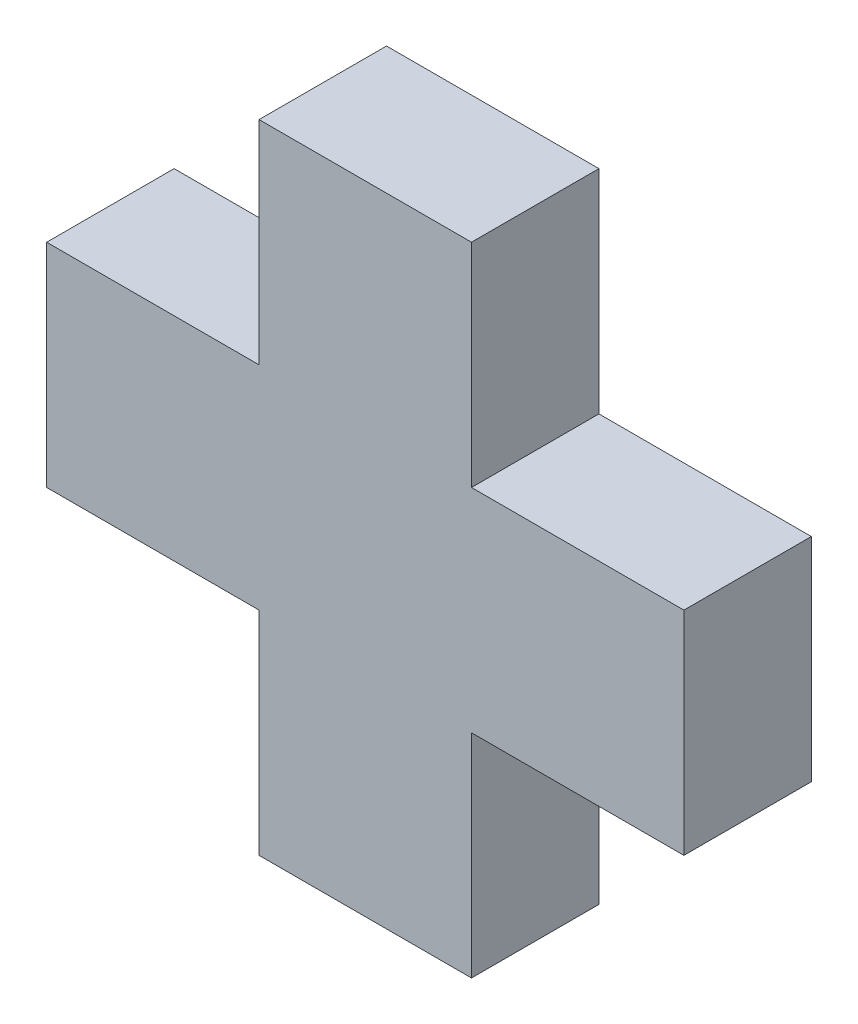
ISO-10303-21;
HEADER;
FILE_DESCRIPTION(('STEP AP214'),'2;1');
FILE_NAME('part.step','',(''),(''),'','','');
FILE_SCHEMA(('AUTOMOTIVE_DESIGN { 1 0 10303 214 1 1 1 1 }'));
ENDSEC;
DATA;
#1=APPLICATION_CONTEXT('core data for automotive mechanical design processes');
#2=APPLICATION_PROTOCOL_DEFINITION('international standard','automotive_design',2000,#1);
#3=PRODUCT_CONTEXT('',#1,'mechanical');
#4=PRODUCT('Part','Part','',(#3));
#5=PRODUCT_RELATED_PRODUCT_CATEGORY('part','',(#4));
#6=PRODUCT_DEFINITION_FORMATION('','',#4);
#7=PRODUCT_DEFINITION_CONTEXT('part definition',#1,'design');
#8=PRODUCT_DEFINITION('design','',#6,#7);
#9=PRODUCT_DEFINITION_SHAPE('','',#8);
#10=(LENGTH_UNIT() NAMED_UNIT(*) SI_UNIT(.MILLI.,.METRE.));
#11=(NAMED_UNIT(*) PLANE_ANGLE_UNIT() SI_UNIT($,.RADIAN.));
#12=(NAMED_UNIT(*) SI_UNIT($,.STERADIAN.) SOLID_ANGLE_UNIT());
#13=UNCERTAINTY_MEASURE_WITH_UNIT(LENGTH_MEASURE(1.E-05),#10,'distance_accuracy_value','');
#14=(GEOMETRIC_REPRESENTATION_CONTEXT(3) GLOBAL_UNCERTAINTY_ASSIGNED_CONTEXT((#13)) GLOBAL_UNIT_ASSIGNED_CONTEXT((#10,
#11,#12)) REPRESENTATION_CONTEXT('',''));
#15=CARTESIAN_POINT('',(0.,0.,0.));
#16=DIRECTION('',(0.,0.,1.));
#17=DIRECTION('',(1.,0.,0.));
#18=AXIS2_PLACEMENT_3D('',#15,#16,#17);
#19=CARTESIAN_POINT('',(0.578703703703703,3.86574074074074,2.));
#20=DIRECTION('',(0.,-1.,0.));
#21=DIRECTION('',(0.,0.,-1.));
#22=AXIS2_PLACEMENT_3D('',#19,#20,#21);
#23=PLANE('',#22);
#24=DIRECTION('',(-1.,0.,0.));
#25=VECTOR('',#24,1.);
#26=CARTESIAN_POINT('',(0.578703703703703,3.86574074074074,0.));
#27=LINE('',#26,#25);
#28=CARTESIAN_POINT('',(0.578703703703703,3.86574074074074,0.));
#29=VERTEX_POINT('',#28);
#30=CARTESIAN_POINT('',(-2.75462962962963,3.86574074074074,0.));
#31=VERTEX_POINT('',#30);
#32=EDGE_CURVE('E153',#29,#31,#27,.T.);
#33=ORIENTED_EDGE('',*,*,#32,.T.);
#34=DIRECTION('',(0.,0.,-1.));
#35=VECTOR('',#34,1.);
#36=CARTESIAN_POINT('',(-2.75462962962963,3.86574074074074,2.));
#37=LINE('',#36,#35);
#38=CARTESIAN_POINT('',(-2.75462962962963,3.86574074074074,2.));
#39=VERTEX_POINT('',#38);
#40=EDGE_CURVE('E11',#39,#31,#37,.T.);
#41=ORIENTED_EDGE('',*,*,#40,.F.);
#42=DIRECTION('',(-1.,0.,0.));
#43=VECTOR('',#42,1.);
#44=CARTESIAN_POINT('',(0.578703703703703,3.86574074074074,2.));
#45=LINE('',#44,#43);
#46=CARTESIAN_POINT('',(0.578703703703703,3.86574074074074,2.));
#47=VERTEX_POINT('',#46);
#48=EDGE_CURVE('E175',#47,#39,#45,.T.);
#49=ORIENTED_EDGE('',*,*,#48,.F.);
#50=DIRECTION('',(0.,0.,-1.));
#51=VECTOR('',#50,1.);
#52=CARTESIAN_POINT('',(0.578703703703703,3.86574074074074,2.));
#53=LINE('',#52,#51);
#54=EDGE_CURVE('E149',#47,#29,#53,.T.);
#55=ORIENTED_EDGE('',*,*,#54,.T.);
#56=EDGE_LOOP('',(#33,#41,#49,#55));
#57=FACE_BOUND('',#56,.T.);
#58=ADVANCED_FACE('F33',(#57),#23,.F.);
#59=CARTESIAN_POINT('',(-2.75462962962963,3.86574074074074,2.));
#60=DIRECTION('',(1.,0.,0.));
#61=DIRECTION('',(0.,0.,-1.));
#62=AXIS2_PLACEMENT_3D('',#59,#60,#61);
#63=PLANE('',#62);
#64=DIRECTION('',(0.,-1.,0.));
#65=VECTOR('',#64,1.);
#66=CARTESIAN_POINT('',(-2.75462962962963,3.86574074074074,0.));
#67=LINE('',#66,#65);
#68=CARTESIAN_POINT('',(-2.75462962962963,0.532407407407409,0.));
#69=VERTEX_POINT('',#68);
#70=EDGE_CURVE('E156',#31,#69,#67,.T.);
#71=ORIENTED_EDGE('',*,*,#70,.T.);
#72=DIRECTION('',(0.,0.,-1.));
#73=VECTOR('',#72,1.);
#74=CARTESIAN_POINT('',(-2.75462962962963,0.532407407407409,2.));
#75=LINE('',#74,#73);
#76=CARTESIAN_POINT('',(-2.75462962962963,0.532407407407409,2.));
#77=VERTEX_POINT('',#76);
#78=EDGE_CURVE('E41',#77,#69,#75,.T.);
#79=ORIENTED_EDGE('',*,*,#78,.F.);
#80=DIRECTION('',(0.,-1.,0.));
#81=VECTOR('',#80,1.);
#82=CARTESIAN_POINT('',(-2.75462962962963,3.86574074074074,2.));
#83=LINE('',#82,#81);
#84=EDGE_CURVE('E104',#39,#77,#83,.T.);
#85=ORIENTED_EDGE('',*,*,#84,.F.);
#86=ORIENTED_EDGE('',*,*,#40,.T.);
#87=EDGE_LOOP('',(#71,#79,#85,#86));
#88=FACE_BOUND('',#87,.T.);
#89=ADVANCED_FACE('F253',(#88),#63,.F.);
#90=CARTESIAN_POINT('',(-2.75462962962963,0.532407407407409,2.));
#91=DIRECTION('',(0.,-1.,0.));
#92=DIRECTION('',(1.,0.,0.));
#93=AXIS2_PLACEMENT_3D('',#90,#91,#92);
#94=PLANE('',#93);
#95=DIRECTION('',(-1.,0.,0.));
#96=VECTOR('',#95,1.);
#97=CARTESIAN_POINT('',(-2.75462962962963,0.532407407407409,0.));
#98=LINE('',#97,#96);
#99=CARTESIAN_POINT('',(-6.08796296296296,0.532407407407409,0.));
#100=VERTEX_POINT('',#99);
#101=EDGE_CURVE('E158',#69,#100,#98,.T.);
#102=ORIENTED_EDGE('',*,*,#101,.T.);
#103=DIRECTION('',(0.,0.,-1.));
#104=VECTOR('',#103,1.);
#105=CARTESIAN_POINT('',(-6.08796296296296,0.532407407407409,2.));
#106=LINE('',#105,#104);
#107=CARTESIAN_POINT('',(-6.08796296296296,0.532407407407409,2.));
#108=VERTEX_POINT('',#107);
#109=EDGE_CURVE('E194',#108,#100,#106,.T.);
#110=ORIENTED_EDGE('',*,*,#109,.F.);
#111=DIRECTION('',(-1.,0.,0.));
#112=VECTOR('',#111,1.);
#113=CARTESIAN_POINT('',(-2.75462962962963,0.532407407407409,2.));
#114=LINE('',#113,#112);
#115=EDGE_CURVE('E202',#77,#108,#114,.T.);
#116=ORIENTED_EDGE('',*,*,#115,.F.);
#117=ORIENTED_EDGE('',*,*,#78,.T.);
#118=EDGE_LOOP('',(#102,#110,#116,#117));
#119=FACE_BOUND('',#118,.T.);
#120=ADVANCED_FACE('F200',(#119),#94,.F.);
#121=CARTESIAN_POINT('',(-6.08796296296296,0.532407407407409,2.));
#122=DIRECTION('',(1.,0.,0.));
#123=DIRECTION('',(0.,1.,0.));
#124=AXIS2_PLACEMENT_3D('',#121,#122,#123);
#125=PLANE('',#124);
#126=DIRECTION('',(0.,-1.,0.));
#127=VECTOR('',#126,1.);
#128=CARTESIAN_POINT('',(-6.08796296296296,0.532407407407409,0.));
#129=LINE('',#128,#127);
#130=CARTESIAN_POINT('',(-6.08796296296296,-2.80092592592592,0.));
#131=VERTEX_POINT('',#130);
#132=EDGE_CURVE('E160',#100,#131,#129,.T.);
#133=ORIENTED_EDGE('',*,*,#132,.T.);
#134=DIRECTION('',(0.,0.,-1.));
#135=VECTOR('',#134,1.);
#136=CARTESIAN_POINT('',(-6.08796296296296,-2.80092592592592,2.));
#137=LINE('',#136,#135);
#138=CARTESIAN_POINT('',(-6.08796296296296,-2.80092592592592,2.));
#139=VERTEX_POINT('',#138);
#140=EDGE_CURVE('E191',#139,#131,#137,.T.);
#141=ORIENTED_EDGE('',*,*,#140,.F.);
#142=DIRECTION('',(0.,-1.,0.));
#143=VECTOR('',#142,1.);
#144=CARTESIAN_POINT('',(-6.08796296296296,0.532407407407409,2.));
#145=LINE('',#144,#143);
#146=EDGE_CURVE('E220',#108,#139,#145,.T.);
#147=ORIENTED_EDGE('',*,*,#146,.F.);
#148=ORIENTED_EDGE('',*,*,#109,.T.);
#149=EDGE_LOOP('',(#133,#141,#147,#148));
#150=FACE_BOUND('',#149,.T.);
#151=ADVANCED_FACE('F211',(#150),#125,.F.);
#152=CARTESIAN_POINT('',(-6.08796296296296,-2.80092592592592,2.));
#153=DIRECTION('',(0.,1.,0.));
#154=DIRECTION('',(-1.,0.,0.));
#155=AXIS2_PLACEMENT_3D('',#152,#153,#154);
#156=PLANE('',#155);
#157=DIRECTION('',(1.,0.,0.));
#158=VECTOR('',#157,1.);
#159=CARTESIAN_POINT('',(-6.08796296296296,-2.80092592592592,0.));
#160=LINE('',#159,#158);
#161=CARTESIAN_POINT('',(-2.75462962962963,-2.80092592592592,0.));
#162=VERTEX_POINT('',#161);
#163=EDGE_CURVE('E162',#131,#162,#160,.T.);
#164=ORIENTED_EDGE('',*,*,#163,.T.);
#165=DIRECTION('',(0.,0.,-1.));
#166=VECTOR('',#165,1.);
#167=CARTESIAN_POINT('',(-2.75462962962963,-2.80092592592592,2.));
#168=LINE('',#167,#166);
#169=CARTESIAN_POINT('',(-2.75462962962963,-2.80092592592592,2.));
#170=VERTEX_POINT('',#169);
#171=EDGE_CURVE('E188',#170,#162,#168,.T.);
#172=ORIENTED_EDGE('',*,*,#171,.F.);
#173=DIRECTION('',(1.,0.,0.));
#174=VECTOR('',#173,1.);
#175=CARTESIAN_POINT('',(-6.08796296296296,-2.80092592592592,2.));
#176=LINE('',#175,#174);
#177=EDGE_CURVE('E217',#139,#170,#176,.T.);
#178=ORIENTED_EDGE('',*,*,#177,.F.);
#179=ORIENTED_EDGE('',*,*,#140,.T.);
#180=EDGE_LOOP('',(#164,#172,#178,#179));
#181=FACE_BOUND('',#180,.T.);
#182=ADVANCED_FACE('F215',(#181),#156,.F.);
#183=CARTESIAN_POINT('',(-2.75462962962963,-2.80092592592592,2.));
#184=DIRECTION('',(1.,0.,0.));
#185=DIRECTION('',(0.,0.,-1.));
#186=AXIS2_PLACEMENT_3D('',#183,#184,#185);
#187=PLANE('',#186);
#188=DIRECTION('',(0.,-1.,0.));
#189=VECTOR('',#188,1.);
#190=CARTESIAN_POINT('',(-2.75462962962963,-2.80092592592592,0.));
#191=LINE('',#190,#189);
#192=CARTESIAN_POINT('',(-2.75462962962963,-6.13425925925926,0.));
#193=VERTEX_POINT('',#192);
#194=EDGE_CURVE('E164',#162,#193,#191,.T.);
#195=ORIENTED_EDGE('',*,*,#194,.T.);
#196=DIRECTION('',(0.,0.,-1.));
#197=VECTOR('',#196,1.);
#198=CARTESIAN_POINT('',(-2.75462962962963,-6.13425925925926,2.));
#199=LINE('',#198,#197);
#200=CARTESIAN_POINT('',(-2.75462962962963,-6.13425925925926,2.));
#201=VERTEX_POINT('',#200);
#202=EDGE_CURVE('E185',#201,#193,#199,.T.);
#203=ORIENTED_EDGE('',*,*,#202,.F.);
#204=DIRECTION('',(0.,-1.,0.));
#205=VECTOR('',#204,1.);
#206=CARTESIAN_POINT('',(-2.75462962962963,-2.80092592592592,2.));
#207=LINE('',#206,#205);
#208=EDGE_CURVE('E219',#170,#201,#207,.T.);
#209=ORIENTED_EDGE('',*,*,#208,.F.);
#210=ORIENTED_EDGE('',*,*,#171,.T.);
#211=EDGE_LOOP('',(#195,#203,#209,#210));
#212=FACE_BOUND('',#211,.T.);
#213=ADVANCED_FACE('F266',(#212),#187,.F.);
#214=CARTESIAN_POINT('',(-2.75462962962963,-6.13425925925926,2.));
#215=DIRECTION('',(0.,1.,0.));
#216=DIRECTION('',(0.,0.,1.));
#217=AXIS2_PLACEMENT_3D('',#214,#215,#216);
#218=PLANE('',#217);
#219=DIRECTION('',(1.,0.,0.));
#220=VECTOR('',#219,1.);
#221=CARTESIAN_POINT('',(-2.75462962962963,-6.13425925925926,0.));
#222=LINE('',#221,#220);
#223=CARTESIAN_POINT('',(0.578703703703703,-6.13425925925926,0.));
#224=VERTEX_POINT('',#223);
#225=EDGE_CURVE('E166',#193,#224,#222,.T.);
#226=ORIENTED_EDGE('',*,*,#225,.T.);
#227=DIRECTION('',(0.,0.,-1.));
#228=VECTOR('',#227,1.);
#229=CARTESIAN_POINT('',(0.578703703703703,-6.13425925925926,2.));
#230=LINE('',#229,#228);
#231=CARTESIAN_POINT('',(0.578703703703703,-6.13425925925926,2.));
#232=VERTEX_POINT('',#231);
#233=EDGE_CURVE('E182',#232,#224,#230,.T.);
#234=ORIENTED_EDGE('',*,*,#233,.F.);
#235=DIRECTION('',(1.,0.,0.));
#236=VECTOR('',#235,1.);
#237=CARTESIAN_POINT('',(-2.75462962962963,-6.13425925925926,2.));
#238=LINE('',#237,#236);
#239=EDGE_CURVE('E222',#201,#232,#238,.T.);
#240=ORIENTED_EDGE('',*,*,#239,.F.);
#241=ORIENTED_EDGE('',*,*,#202,.T.);
#242=EDGE_LOOP('',(#226,#234,#240,#241));
#243=FACE_BOUND('',#242,.T.);
#244=ADVANCED_FACE('F269',(#243),#218,.F.);
#245=CARTESIAN_POINT('',(0.578703703703703,-6.13425925925926,2.));
#246=DIRECTION('',(-1.,0.,0.));
#247=DIRECTION('',(0.,0.,1.));
#248=AXIS2_PLACEMENT_3D('',#245,#246,#247);
#249=PLANE('',#248);
#250=DIRECTION('',(0.,1.,0.));
#251=VECTOR('',#250,1.);
#252=CARTESIAN_POINT('',(0.578703703703703,-6.13425925925926,0.));
#253=LINE('',#252,#251);
#254=CARTESIAN_POINT('',(0.578703703703703,-2.80092592592592,0.));
#255=VERTEX_POINT('',#254);
#256=EDGE_CURVE('E168',#224,#255,#253,.T.);
#257=ORIENTED_EDGE('',*,*,#256,.T.);
#258=DIRECTION('',(0.,0.,-1.));
#259=VECTOR('',#258,1.);
#260=CARTESIAN_POINT('',(0.578703703703703,-2.80092592592592,2.));
#261=LINE('',#260,#259);
#262=CARTESIAN_POINT('',(0.578703703703703,-2.80092592592592,2.));
#263=VERTEX_POINT('',#262);
#264=EDGE_CURVE('E179',#263,#255,#261,.T.);
#265=ORIENTED_EDGE('',*,*,#264,.F.);
#266=DIRECTION('',(0.,1.,0.));
#267=VECTOR('',#266,1.);
#268=CARTESIAN_POINT('',(0.578703703703703,-6.13425925925926,2.));
#269=LINE('',#268,#267);
#270=EDGE_CURVE('E228',#232,#263,#269,.T.);
#271=ORIENTED_EDGE('',*,*,#270,.F.);
#272=ORIENTED_EDGE('',*,*,#233,.T.);
#273=EDGE_LOOP('',(#257,#265,#271,#272));
#274=FACE_BOUND('',#273,.T.);
#275=ADVANCED_FACE('F234',(#274),#249,.F.);
#276=CARTESIAN_POINT('',(0.578703703703703,-2.80092592592592,2.));
#277=DIRECTION('',(0.,1.,0.));
#278=DIRECTION('',(0.,0.,1.));
#279=AXIS2_PLACEMENT_3D('',#276,#277,#278);
#280=PLANE('',#279);
#281=DIRECTION('',(1.,0.,0.));
#282=VECTOR('',#281,1.);
#283=CARTESIAN_POINT('',(0.578703703703703,-2.80092592592592,0.));
#284=LINE('',#283,#282);
#285=CARTESIAN_POINT('',(3.91203703703704,-2.80092592592592,0.));
#286=VERTEX_POINT('',#285);
#287=EDGE_CURVE('E170',#255,#286,#284,.T.);
#288=ORIENTED_EDGE('',*,*,#287,.T.);
#289=DIRECTION('',(0.,0.,-1.));
#290=VECTOR('',#289,1.);
#291=CARTESIAN_POINT('',(3.91203703703704,-2.80092592592592,2.));
#292=LINE('',#291,#290);
#293=CARTESIAN_POINT('',(3.91203703703704,-2.80092592592592,2.));
#294=VERTEX_POINT('',#293);
#295=EDGE_CURVE('E144',#294,#286,#292,.T.);
#296=ORIENTED_EDGE('',*,*,#295,.F.);
#297=DIRECTION('',(1.,0.,0.));
#298=VECTOR('',#297,1.);
#299=CARTESIAN_POINT('',(0.578703703703703,-2.80092592592592,2.));
#300=LINE('',#299,#298);
#301=EDGE_CURVE('E135',#263,#294,#300,.T.);
#302=ORIENTED_EDGE('',*,*,#301,.F.);
#303=ORIENTED_EDGE('',*,*,#264,.T.);
#304=EDGE_LOOP('',(#288,#296,#302,#303));
#305=FACE_BOUND('',#304,.T.);
#306=ADVANCED_FACE('F238',(#305),#280,.F.);
#307=CARTESIAN_POINT('',(3.91203703703704,-2.80092592592592,2.));
#308=DIRECTION('',(-1.,0.,0.));
#309=DIRECTION('',(0.,0.,1.));
#310=AXIS2_PLACEMENT_3D('',#307,#308,#309);
#311=PLANE('',#310);
#312=DIRECTION('',(0.,1.,0.));
#313=VECTOR('',#312,1.);
#314=CARTESIAN_POINT('',(3.91203703703704,-2.80092592592592,0.));
#315=LINE('',#314,#313);
#316=CARTESIAN_POINT('',(3.91203703703704,0.53240740740741,0.));
#317=VERTEX_POINT('',#316);
#318=EDGE_CURVE('E143',#286,#317,#315,.T.);
#319=ORIENTED_EDGE('',*,*,#318,.T.);
#320=DIRECTION('',(0.,0.,-1.));
#321=VECTOR('',#320,1.);
#322=CARTESIAN_POINT('',(3.91203703703704,0.53240740740741,2.));
#323=LINE('',#322,#321);
#324=CARTESIAN_POINT('',(3.91203703703704,0.53240740740741,2.));
#325=VERTEX_POINT('',#324);
#326=EDGE_CURVE('E140',#325,#317,#323,.T.);
#327=ORIENTED_EDGE('',*,*,#326,.F.);
#328=DIRECTION('',(0.,1.,0.));
#329=VECTOR('',#328,1.);
#330=CARTESIAN_POINT('',(3.91203703703704,-2.80092592592592,2.));
#331=LINE('',#330,#329);
#332=EDGE_CURVE('E129',#294,#325,#331,.T.);
#333=ORIENTED_EDGE('',*,*,#332,.F.);
#334=ORIENTED_EDGE('',*,*,#295,.T.);
#335=EDGE_LOOP('',(#319,#327,#333,#334));
#336=FACE_BOUND('',#335,.T.);
#337=ADVANCED_FACE('F141',(#336),#311,.F.);
#338=CARTESIAN_POINT('',(3.91203703703704,0.53240740740741,2.));
#339=DIRECTION('',(0.,-1.,0.));
#340=DIRECTION('',(1.,0.,0.));
#341=AXIS2_PLACEMENT_3D('',#338,#339,#340);
#342=PLANE('',#341);
#343=DIRECTION('',(-1.,0.,0.));
#344=VECTOR('',#343,1.);
#345=CARTESIAN_POINT('',(3.91203703703704,0.53240740740741,0.));
#346=LINE('',#345,#344);
#347=CARTESIAN_POINT('',(0.578703703703703,0.532407407407409,0.));
#348=VERTEX_POINT('',#347);
#349=EDGE_CURVE('E90',#317,#348,#346,.T.);
#350=ORIENTED_EDGE('',*,*,#349,.T.);
#351=DIRECTION('',(0.,0.,-1.));
#352=VECTOR('',#351,1.);
#353=CARTESIAN_POINT('',(0.578703703703703,0.532407407407409,2.));
#354=LINE('',#353,#352);
#355=CARTESIAN_POINT('',(0.578703703703703,0.532407407407409,2.));
#356=VERTEX_POINT('',#355);
#357=EDGE_CURVE('E145',#356,#348,#354,.T.);
#358=ORIENTED_EDGE('',*,*,#357,.F.);
#359=DIRECTION('',(-1.,0.,0.));
#360=VECTOR('',#359,1.);
#361=CARTESIAN_POINT('',(3.91203703703704,0.53240740740741,2.));
#362=LINE('',#361,#360);
#363=EDGE_CURVE('E133',#325,#356,#362,.T.);
#364=ORIENTED_EDGE('',*,*,#363,.F.);
#365=ORIENTED_EDGE('',*,*,#326,.T.);
#366=EDGE_LOOP('',(#350,#358,#364,#365));
#367=FACE_BOUND('',#366,.T.);
#368=ADVANCED_FACE('F147',(#367),#342,.F.);
#369=CARTESIAN_POINT('',(0.578703703703703,0.532407407407409,2.));
#370=DIRECTION('',(-1.,0.,0.));
#371=DIRECTION('',(0.,0.,1.));
#372=AXIS2_PLACEMENT_3D('',#369,#370,#371);
#373=PLANE('',#372);
#374=DIRECTION('',(0.,1.,0.));
#375=VECTOR('',#374,1.);
#376=CARTESIAN_POINT('',(0.578703703703703,0.532407407407409,0.));
#377=LINE('',#376,#375);
#378=EDGE_CURVE('E96',#348,#29,#377,.T.);
#379=ORIENTED_EDGE('',*,*,#378,.T.);
#380=ORIENTED_EDGE('',*,*,#54,.F.);
#381=DIRECTION('',(0.,1.,0.));
#382=VECTOR('',#381,1.);
#383=CARTESIAN_POINT('',(0.578703703703703,0.532407407407409,2.));
#384=LINE('',#383,#382);
#385=EDGE_CURVE('E49',#356,#47,#384,.T.);
#386=ORIENTED_EDGE('',*,*,#385,.F.);
#387=ORIENTED_EDGE('',*,*,#357,.T.);
#388=EDGE_LOOP('',(#379,#380,#386,#387));
#389=FACE_BOUND('',#388,.T.);
#390=ADVANCED_FACE('F242',(#389),#373,.F.);
#391=CARTESIAN_POINT('',(0.,0.,2.));
#392=DIRECTION('',(0.,0.,1.));
#393=DIRECTION('',(1.,0.,0.));
#394=AXIS2_PLACEMENT_3D('',#391,#392,#393);
#395=PLANE('',#394);
#396=ORIENTED_EDGE('',*,*,#48,.T.);
#397=ORIENTED_EDGE('',*,*,#84,.T.);
#398=ORIENTED_EDGE('',*,*,#115,.T.);
#399=ORIENTED_EDGE('',*,*,#146,.T.);
#400=ORIENTED_EDGE('',*,*,#177,.T.);
#401=ORIENTED_EDGE('',*,*,#208,.T.);
#402=ORIENTED_EDGE('',*,*,#239,.T.);
#403=ORIENTED_EDGE('',*,*,#270,.T.);
#404=ORIENTED_EDGE('',*,*,#301,.T.);
#405=ORIENTED_EDGE('',*,*,#332,.T.);
#406=ORIENTED_EDGE('',*,*,#363,.T.);
#407=ORIENTED_EDGE('',*,*,#385,.T.);
#408=EDGE_LOOP('',(#396,#397,#398,#399,#400,#401,#402,#403,#404,#405,#406,#407));
#409=FACE_BOUND('',#408,.T.);
#410=ADVANCED_FACE('F131',(#409),#395,.T.);
#411=CARTESIAN_POINT('',(0.,0.,0.));
#412=DIRECTION('',(0.,0.,1.));
#413=DIRECTION('',(1.,0.,0.));
#414=AXIS2_PLACEMENT_3D('',#411,#412,#413);
#415=PLANE('',#414);
#416=ORIENTED_EDGE('',*,*,#32,.F.);
#417=ORIENTED_EDGE('',*,*,#378,.F.);
#418=ORIENTED_EDGE('',*,*,#349,.F.);
#419=ORIENTED_EDGE('',*,*,#318,.F.);
#420=ORIENTED_EDGE('',*,*,#287,.F.);
#421=ORIENTED_EDGE('',*,*,#256,.F.);
#422=ORIENTED_EDGE('',*,*,#225,.F.);
#423=ORIENTED_EDGE('',*,*,#194,.F.);
#424=ORIENTED_EDGE('',*,*,#163,.F.);
#425=ORIENTED_EDGE('',*,*,#132,.F.);
#426=ORIENTED_EDGE('',*,*,#101,.F.);
#427=ORIENTED_EDGE('',*,*,#70,.F.);
#428=EDGE_LOOP('',(#416,#417,#418,#419,#420,#421,#422,#423,#424,#425,#426,#427));
#429=FACE_BOUND('',#428,.T.);
#430=ADVANCED_FACE('F206',(#429),#415,.F.);
#431=CLOSED_SHELL('',(#58,#89,#120,#151,#182,#213,#244,#275,#306,#337,#368,#390,#410,#430));
#432=MANIFOLD_SOLID_BREP('B2',#431);
#433=ADVANCED_BREP_SHAPE_REPRESENTATION('',(#18,#432),#14);
#434=SHAPE_DEFINITION_REPRESENTATION(#9,#433);
ENDSEC;
END-ISO-10303-21;
